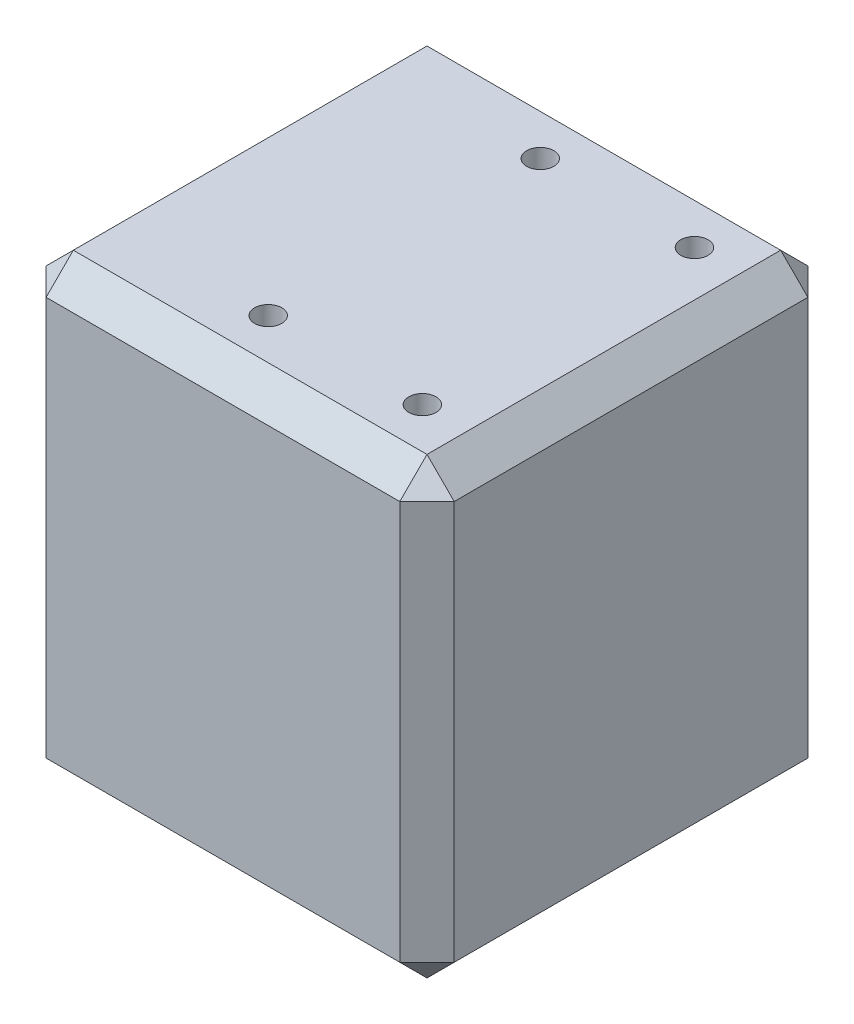
ISO-10303-21;
HEADER;
FILE_DESCRIPTION(('STEP AP214'),'2;1');
FILE_NAME('part.step','',(''),(''),'','','');
FILE_SCHEMA(('AUTOMOTIVE_DESIGN { 1 0 10303 214 1 1 1 1 }'));
ENDSEC;
DATA;
#1=APPLICATION_CONTEXT('core data for automotive mechanical design processes');
#2=APPLICATION_PROTOCOL_DEFINITION('international standard','automotive_design',2000,#1);
#3=PRODUCT_CONTEXT('',#1,'mechanical');
#4=PRODUCT('Part','Part','',(#3));
#5=PRODUCT_RELATED_PRODUCT_CATEGORY('part','',(#4));
#6=PRODUCT_DEFINITION_FORMATION('','',#4);
#7=PRODUCT_DEFINITION_CONTEXT('part definition',#1,'design');
#8=PRODUCT_DEFINITION('design','',#6,#7);
#9=PRODUCT_DEFINITION_SHAPE('','',#8);
#10=(LENGTH_UNIT() NAMED_UNIT(*) SI_UNIT(.MILLI.,.METRE.));
#11=(NAMED_UNIT(*) PLANE_ANGLE_UNIT() SI_UNIT($,.RADIAN.));
#12=(NAMED_UNIT(*) SI_UNIT($,.STERADIAN.) SOLID_ANGLE_UNIT());
#13=UNCERTAINTY_MEASURE_WITH_UNIT(LENGTH_MEASURE(1.E-05),#10,'distance_accuracy_value','');
#14=(GEOMETRIC_REPRESENTATION_CONTEXT(3) GLOBAL_UNCERTAINTY_ASSIGNED_CONTEXT((#13)) GLOBAL_UNIT_ASSIGNED_CONTEXT((#10,
#11,#12)) REPRESENTATION_CONTEXT('',''));
#15=CARTESIAN_POINT('',(0.,0.,0.));
#16=DIRECTION('',(0.,0.,1.));
#17=DIRECTION('',(1.,0.,0.));
#18=AXIS2_PLACEMENT_3D('',#15,#16,#17);
#19=CARTESIAN_POINT('',(22.5,50.,-22.5));
#20=DIRECTION('',(-1.,0.,0.));
#21=DIRECTION('',(0.,0.,1.));
#22=AXIS2_PLACEMENT_3D('',#19,#20,#21);
#23=PLANE('',#22);
#24=DIRECTION('',(0.,1.,0.));
#25=VECTOR('',#24,1.);
#26=CARTESIAN_POINT('',(22.5,50.,-19.5));
#27=LINE('',#26,#25);
#28=CARTESIAN_POINT('',(22.5,3.00000000000002,-19.5));
#29=VERTEX_POINT('',#28);
#30=CARTESIAN_POINT('',(22.5,47.,-19.5));
#31=VERTEX_POINT('',#30);
#32=EDGE_CURVE('E193',#29,#31,#27,.T.);
#33=ORIENTED_EDGE('',*,*,#32,.T.);
#34=DIRECTION('',(0.,0.,1.));
#35=VECTOR('',#34,1.);
#36=CARTESIAN_POINT('',(22.5,47.,22.5));
#37=LINE('',#36,#35);
#38=CARTESIAN_POINT('',(22.5,47.,19.5));
#39=VERTEX_POINT('',#38);
#40=EDGE_CURVE('E199',#31,#39,#37,.T.);
#41=ORIENTED_EDGE('',*,*,#40,.T.);
#42=DIRECTION('',(0.,-1.,0.));
#43=VECTOR('',#42,1.);
#44=CARTESIAN_POINT('',(22.5,50.,19.5));
#45=LINE('',#44,#43);
#46=CARTESIAN_POINT('',(22.5,3.00000000000002,19.5));
#47=VERTEX_POINT('',#46);
#48=EDGE_CURVE('E197',#39,#47,#45,.T.);
#49=ORIENTED_EDGE('',*,*,#48,.T.);
#50=DIRECTION('',(0.,0.,-1.));
#51=VECTOR('',#50,1.);
#52=CARTESIAN_POINT('',(22.5,3.00000000000002,-22.5));
#53=LINE('',#52,#51);
#54=EDGE_CURVE('E195',#47,#29,#53,.T.);
#55=ORIENTED_EDGE('',*,*,#54,.T.);
#56=EDGE_LOOP('',(#33,#41,#49,#55));
#57=FACE_BOUND('',#56,.T.);
#58=ADVANCED_FACE('F35',(#57),#23,.F.);
#59=CARTESIAN_POINT('',(-22.5,50.,-22.5));
#60=DIRECTION('',(0.,0.,1.));
#61=DIRECTION('',(1.,0.,0.));
#62=AXIS2_PLACEMENT_3D('',#59,#60,#61);
#63=PLANE('',#62);
#64=DIRECTION('',(0.,1.,0.));
#65=VECTOR('',#64,1.);
#66=CARTESIAN_POINT('',(-19.5,50.,-22.5));
#67=LINE('',#66,#65);
#68=CARTESIAN_POINT('',(-19.5,3.,-22.5));
#69=VERTEX_POINT('',#68);
#70=CARTESIAN_POINT('',(-19.5,47.,-22.5));
#71=VERTEX_POINT('',#70);
#72=EDGE_CURVE('E188',#69,#71,#67,.T.);
#73=ORIENTED_EDGE('',*,*,#72,.T.);
#74=DIRECTION('',(1.,0.,0.));
#75=VECTOR('',#74,1.);
#76=CARTESIAN_POINT('',(22.5,47.,-22.5));
#77=LINE('',#76,#75);
#78=CARTESIAN_POINT('',(19.5,47.,-22.5));
#79=VERTEX_POINT('',#78);
#80=EDGE_CURVE('E190',#71,#79,#77,.T.);
#81=ORIENTED_EDGE('',*,*,#80,.T.);
#82=DIRECTION('',(0.,-1.,0.));
#83=VECTOR('',#82,1.);
#84=CARTESIAN_POINT('',(19.5,50.,-22.5));
#85=LINE('',#84,#83);
#86=CARTESIAN_POINT('',(19.5,3.,-22.5));
#87=VERTEX_POINT('',#86);
#88=EDGE_CURVE('E184',#79,#87,#85,.T.);
#89=ORIENTED_EDGE('',*,*,#88,.T.);
#90=DIRECTION('',(-1.,0.,0.));
#91=VECTOR('',#90,1.);
#92=CARTESIAN_POINT('',(-22.5,3.,-22.5));
#93=LINE('',#92,#91);
#94=EDGE_CURVE('E186',#87,#69,#93,.T.);
#95=ORIENTED_EDGE('',*,*,#94,.T.);
#96=EDGE_LOOP('',(#73,#81,#89,#95));
#97=FACE_BOUND('',#96,.T.);
#98=CARTESIAN_POINT('',(0.,12.5,-22.5));
#99=DIRECTION('',(0.,0.,-1.));
#100=DIRECTION('',(-1.,0.,0.));
#101=AXIS2_PLACEMENT_3D('',#98,#99,#100);
#102=CIRCLE('',#101,4.15);
#103=CARTESIAN_POINT('',(-4.15,12.5,-22.5));
#104=VERTEX_POINT('',#103);
#105=EDGE_CURVE('E272',#104,#104,#102,.T.);
#106=ORIENTED_EDGE('',*,*,#105,.F.);
#107=EDGE_LOOP('',(#106));
#108=FACE_BOUND('',#107,.T.);
#109=ADVANCED_FACE('F329',(#97,#108),#63,.F.);
#110=CARTESIAN_POINT('',(-22.5,50.,-22.5));
#111=DIRECTION('',(1.,0.,0.));
#112=DIRECTION('',(0.,0.,-1.));
#113=AXIS2_PLACEMENT_3D('',#110,#111,#112);
#114=PLANE('',#113);
#115=DIRECTION('',(0.,1.,0.));
#116=VECTOR('',#115,1.);
#117=CARTESIAN_POINT('',(-22.5,50.,19.5));
#118=LINE('',#117,#116);
#119=CARTESIAN_POINT('',(-22.5,3.,19.5));
#120=VERTEX_POINT('',#119);
#121=CARTESIAN_POINT('',(-22.5,47.,19.5));
#122=VERTEX_POINT('',#121);
#123=EDGE_CURVE('E179',#120,#122,#118,.T.);
#124=ORIENTED_EDGE('',*,*,#123,.T.);
#125=DIRECTION('',(0.,0.,-1.));
#126=VECTOR('',#125,1.);
#127=CARTESIAN_POINT('',(-22.5,47.,-22.5));
#128=LINE('',#127,#126);
#129=CARTESIAN_POINT('',(-22.5,47.,-19.5));
#130=VERTEX_POINT('',#129);
#131=EDGE_CURVE('E181',#122,#130,#128,.T.);
#132=ORIENTED_EDGE('',*,*,#131,.T.);
#133=DIRECTION('',(0.,-1.,0.));
#134=VECTOR('',#133,1.);
#135=CARTESIAN_POINT('',(-22.5,50.,-19.5));
#136=LINE('',#135,#134);
#137=CARTESIAN_POINT('',(-22.5,3.,-19.5));
#138=VERTEX_POINT('',#137);
#139=EDGE_CURVE('E175',#130,#138,#136,.T.);
#140=ORIENTED_EDGE('',*,*,#139,.T.);
#141=DIRECTION('',(0.,0.,1.));
#142=VECTOR('',#141,1.);
#143=CARTESIAN_POINT('',(-22.5,3.,-22.5));
#144=LINE('',#143,#142);
#145=EDGE_CURVE('E177',#138,#120,#144,.T.);
#146=ORIENTED_EDGE('',*,*,#145,.T.);
#147=EDGE_LOOP('',(#124,#132,#140,#146));
#148=FACE_BOUND('',#147,.T.);
#149=CARTESIAN_POINT('',(-22.5,37.5,0.));
#150=DIRECTION('',(-1.,0.,0.));
#151=DIRECTION('',(0.,0.,1.));
#152=AXIS2_PLACEMENT_3D('',#149,#150,#151);
#153=CIRCLE('',#152,4.15);
#154=CARTESIAN_POINT('',(-22.5,37.5,4.15000000000001));
#155=VERTEX_POINT('',#154);
#156=EDGE_CURVE('E261',#155,#155,#153,.T.);
#157=ORIENTED_EDGE('',*,*,#156,.F.);
#158=EDGE_LOOP('',(#157));
#159=FACE_BOUND('',#158,.T.);
#160=ADVANCED_FACE('F335',(#148,#159),#114,.F.);
#161=CARTESIAN_POINT('',(-22.5,50.,22.5));
#162=DIRECTION('',(0.,0.,-1.));
#163=DIRECTION('',(-1.,0.,0.));
#164=AXIS2_PLACEMENT_3D('',#161,#162,#163);
#165=PLANE('',#164);
#166=DIRECTION('',(1.,0.,0.));
#167=VECTOR('',#166,1.);
#168=CARTESIAN_POINT('',(-22.5,3.,22.5));
#169=LINE('',#168,#167);
#170=CARTESIAN_POINT('',(-19.5,3.,22.5));
#171=VERTEX_POINT('',#170);
#172=CARTESIAN_POINT('',(19.5,3.,22.5));
#173=VERTEX_POINT('',#172);
#174=EDGE_CURVE('E166',#171,#173,#169,.T.);
#175=ORIENTED_EDGE('',*,*,#174,.T.);
#176=DIRECTION('',(0.,1.,0.));
#177=VECTOR('',#176,1.);
#178=CARTESIAN_POINT('',(19.5,50.,22.5));
#179=LINE('',#178,#177);
#180=CARTESIAN_POINT('',(19.5,47.,22.5));
#181=VERTEX_POINT('',#180);
#182=EDGE_CURVE('E173',#173,#181,#179,.T.);
#183=ORIENTED_EDGE('',*,*,#182,.T.);
#184=DIRECTION('',(-1.,0.,0.));
#185=VECTOR('',#184,1.);
#186=CARTESIAN_POINT('',(-22.5,47.,22.5));
#187=LINE('',#186,#185);
#188=CARTESIAN_POINT('',(-19.5,47.,22.5));
#189=VERTEX_POINT('',#188);
#190=EDGE_CURVE('E134',#181,#189,#187,.T.);
#191=ORIENTED_EDGE('',*,*,#190,.T.);
#192=DIRECTION('',(0.,-1.,0.));
#193=VECTOR('',#192,1.);
#194=CARTESIAN_POINT('',(-19.5,50.,22.5));
#195=LINE('',#194,#193);
#196=EDGE_CURVE('E164',#189,#171,#195,.T.);
#197=ORIENTED_EDGE('',*,*,#196,.T.);
#198=EDGE_LOOP('',(#175,#183,#191,#197));
#199=FACE_BOUND('',#198,.T.);
#200=ADVANCED_FACE('F302',(#199),#165,.F.);
#201=CARTESIAN_POINT('',(0.,50.,0.));
#202=DIRECTION('',(0.,1.,0.));
#203=DIRECTION('',(0.,0.,1.));
#204=AXIS2_PLACEMENT_3D('',#201,#202,#203);
#205=PLANE('',#204);
#206=CARTESIAN_POINT('',(-2.51000000000001,50.,-15.0000000000001));
#207=DIRECTION('',(0.,1.,0.));
#208=DIRECTION('',(0.,0.,-1.));
#209=AXIS2_PLACEMENT_3D('',#206,#207,#208);
#210=CIRCLE('',#209,1.5);
#211=CARTESIAN_POINT('',(-2.51000000000001,50.,-16.5000000000001));
#212=VERTEX_POINT('',#211);
#213=EDGE_CURVE('E661',#212,#212,#210,.T.);
#214=ORIENTED_EDGE('',*,*,#213,.F.);
#215=EDGE_LOOP('',(#214));
#216=FACE_BOUND('',#215,.T.);
#217=CARTESIAN_POINT('',(14.49,50.,-15.0000000000001));
#218=DIRECTION('',(0.,1.,0.));
#219=DIRECTION('',(0.,0.,-1.));
#220=AXIS2_PLACEMENT_3D('',#217,#218,#219);
#221=CIRCLE('',#220,1.5);
#222=CARTESIAN_POINT('',(14.49,50.,-16.5000000000001));
#223=VERTEX_POINT('',#222);
#224=EDGE_CURVE('E665',#223,#223,#221,.T.);
#225=ORIENTED_EDGE('',*,*,#224,.F.);
#226=EDGE_LOOP('',(#225));
#227=FACE_BOUND('',#226,.T.);
#228=CARTESIAN_POINT('',(14.49,50.,15.0000000000001));
#229=DIRECTION('',(0.,1.,0.));
#230=DIRECTION('',(0.,0.,1.));
#231=AXIS2_PLACEMENT_3D('',#228,#229,#230);
#232=CIRCLE('',#231,1.5);
#233=CARTESIAN_POINT('',(14.49,50.,16.5000000000001));
#234=VERTEX_POINT('',#233);
#235=EDGE_CURVE('E669',#234,#234,#232,.T.);
#236=ORIENTED_EDGE('',*,*,#235,.F.);
#237=EDGE_LOOP('',(#236));
#238=FACE_BOUND('',#237,.T.);
#239=CARTESIAN_POINT('',(-2.51,50.,15.0000000000001));
#240=DIRECTION('',(0.,1.,0.));
#241=DIRECTION('',(0.,0.,1.));
#242=AXIS2_PLACEMENT_3D('',#239,#240,#241);
#243=CIRCLE('',#242,1.5);
#244=CARTESIAN_POINT('',(-2.51,50.,16.5000000000001));
#245=VERTEX_POINT('',#244);
#246=EDGE_CURVE('E672',#245,#245,#243,.T.);
#247=ORIENTED_EDGE('',*,*,#246,.F.);
#248=EDGE_LOOP('',(#247));
#249=FACE_BOUND('',#248,.T.);
#250=DIRECTION('',(0.,0.,1.));
#251=VECTOR('',#250,1.);
#252=CARTESIAN_POINT('',(-19.5,50.,22.5));
#253=LINE('',#252,#251);
#254=CARTESIAN_POINT('',(-19.5,50.,-19.5));
#255=VERTEX_POINT('',#254);
#256=CARTESIAN_POINT('',(-19.5,50.,19.5));
#257=VERTEX_POINT('',#256);
#258=EDGE_CURVE('E162',#255,#257,#253,.T.);
#259=ORIENTED_EDGE('',*,*,#258,.T.);
#260=DIRECTION('',(1.,0.,0.));
#261=VECTOR('',#260,1.);
#262=CARTESIAN_POINT('',(22.5,50.,19.5));
#263=LINE('',#262,#261);
#264=CARTESIAN_POINT('',(19.5,50.,19.5));
#265=VERTEX_POINT('',#264);
#266=EDGE_CURVE('E132',#257,#265,#263,.T.);
#267=ORIENTED_EDGE('',*,*,#266,.T.);
#268=DIRECTION('',(0.,0.,-1.));
#269=VECTOR('',#268,1.);
#270=CARTESIAN_POINT('',(19.5,50.,-22.5));
#271=LINE('',#270,#269);
#272=CARTESIAN_POINT('',(19.5,50.,-19.5));
#273=VERTEX_POINT('',#272);
#274=EDGE_CURVE('E151',#265,#273,#271,.T.);
#275=ORIENTED_EDGE('',*,*,#274,.T.);
#276=DIRECTION('',(-1.,0.,0.));
#277=VECTOR('',#276,1.);
#278=CARTESIAN_POINT('',(-22.5,50.,-19.5));
#279=LINE('',#278,#277);
#280=EDGE_CURVE('E157',#273,#255,#279,.T.);
#281=ORIENTED_EDGE('',*,*,#280,.T.);
#282=EDGE_LOOP('',(#259,#267,#275,#281));
#283=FACE_BOUND('',#282,.T.);
#284=ADVANCED_FACE('F160',(#216,#227,#238,#249,#283),#205,.T.);
#285=CARTESIAN_POINT('',(0.,0.,0.));
#286=DIRECTION('',(0.,1.,0.));
#287=DIRECTION('',(0.,0.,1.));
#288=AXIS2_PLACEMENT_3D('',#285,#286,#287);
#289=PLANE('',#288);
#290=DIRECTION('',(0.,0.,1.));
#291=VECTOR('',#290,1.);
#292=CARTESIAN_POINT('',(19.5,0.,0.));
#293=LINE('',#292,#291);
#294=CARTESIAN_POINT('',(19.5,0.,-19.5));
#295=VERTEX_POINT('',#294);
#296=CARTESIAN_POINT('',(19.5,0.,19.5));
#297=VERTEX_POINT('',#296);
#298=EDGE_CURVE('E44',#295,#297,#293,.T.);
#299=ORIENTED_EDGE('',*,*,#298,.T.);
#300=DIRECTION('',(-1.,0.,0.));
#301=VECTOR('',#300,1.);
#302=CARTESIAN_POINT('',(0.,0.,19.5));
#303=LINE('',#302,#301);
#304=CARTESIAN_POINT('',(-19.5,0.,19.5));
#305=VERTEX_POINT('',#304);
#306=EDGE_CURVE('E11',#297,#305,#303,.T.);
#307=ORIENTED_EDGE('',*,*,#306,.T.);
#308=DIRECTION('',(0.,0.,-1.));
#309=VECTOR('',#308,1.);
#310=CARTESIAN_POINT('',(-19.5,0.,0.));
#311=LINE('',#310,#309);
#312=CARTESIAN_POINT('',(-19.5,0.,-19.5));
#313=VERTEX_POINT('',#312);
#314=EDGE_CURVE('E204',#305,#313,#311,.T.);
#315=ORIENTED_EDGE('',*,*,#314,.T.);
#316=DIRECTION('',(1.,0.,0.));
#317=VECTOR('',#316,1.);
#318=CARTESIAN_POINT('',(0.,0.,-19.5));
#319=LINE('',#318,#317);
#320=EDGE_CURVE('E202',#313,#295,#319,.T.);
#321=ORIENTED_EDGE('',*,*,#320,.T.);
#322=EDGE_LOOP('',(#299,#307,#315,#321));
#323=FACE_BOUND('',#322,.T.);
#324=ADVANCED_FACE('F604',(#323),#289,.F.);
#325=CARTESIAN_POINT('',(0.,12.5,7.5));
#326=DIRECTION('',(0.,0.,-1.));
#327=DIRECTION('',(-1.,0.,0.));
#328=AXIS2_PLACEMENT_3D('',#325,#326,#327);
#329=CYLINDRICAL_SURFACE('',#328,4.15);
#330=CARTESIAN_POINT('',(0.,12.5,7.5));
#331=DIRECTION('',(0.,0.,-1.));
#332=DIRECTION('',(-1.,0.,0.));
#333=AXIS2_PLACEMENT_3D('',#330,#331,#332);
#334=CIRCLE('',#333,4.15);
#335=CARTESIAN_POINT('',(-4.15,12.5,7.5));
#336=VERTEX_POINT('',#335);
#337=EDGE_CURVE('E158',#336,#336,#334,.T.);
#338=ORIENTED_EDGE('',*,*,#337,.F.);
#339=EDGE_LOOP('',(#338));
#340=FACE_BOUND('',#339,.T.);
#341=ORIENTED_EDGE('',*,*,#105,.T.);
#342=EDGE_LOOP('',(#341));
#343=FACE_BOUND('',#342,.T.);
#344=ADVANCED_FACE('F595',(#340,#343),#329,.F.);
#345=CARTESIAN_POINT('',(0.,12.5,7.5));
#346=DIRECTION('',(0.,0.,-1.));
#347=DIRECTION('',(-1.,0.,0.));
#348=AXIS2_PLACEMENT_3D('',#345,#346,#347);
#349=PLANE('',#348);
#350=ORIENTED_EDGE('',*,*,#337,.T.);
#351=EDGE_LOOP('',(#350));
#352=FACE_BOUND('',#351,.T.);
#353=ADVANCED_FACE('F586',(#352),#349,.T.);
#354=CARTESIAN_POINT('',(7.50000000000001,37.5,0.));
#355=DIRECTION('',(-1.,0.,0.));
#356=DIRECTION('',(0.,0.,1.));
#357=AXIS2_PLACEMENT_3D('',#354,#355,#356);
#358=CYLINDRICAL_SURFACE('',#357,4.15);
#359=CARTESIAN_POINT('',(7.50000000000001,37.5,0.));
#360=DIRECTION('',(-1.,0.,0.));
#361=DIRECTION('',(0.,0.,1.));
#362=AXIS2_PLACEMENT_3D('',#359,#360,#361);
#363=CIRCLE('',#362,4.15);
#364=CARTESIAN_POINT('',(7.50000000000001,37.5,4.15));
#365=VERTEX_POINT('',#364);
#366=EDGE_CURVE('E267',#365,#365,#363,.T.);
#367=ORIENTED_EDGE('',*,*,#366,.F.);
#368=EDGE_LOOP('',(#367));
#369=FACE_BOUND('',#368,.T.);
#370=ORIENTED_EDGE('',*,*,#156,.T.);
#371=EDGE_LOOP('',(#370));
#372=FACE_BOUND('',#371,.T.);
#373=ADVANCED_FACE('F577',(#369,#372),#358,.F.);
#374=CARTESIAN_POINT('',(7.50000000000001,37.5,0.));
#375=DIRECTION('',(-1.,0.,0.));
#376=DIRECTION('',(0.,0.,1.));
#377=AXIS2_PLACEMENT_3D('',#374,#375,#376);
#378=PLANE('',#377);
#379=ORIENTED_EDGE('',*,*,#366,.T.);
#380=EDGE_LOOP('',(#379));
#381=FACE_BOUND('',#380,.T.);
#382=ADVANCED_FACE('F569',(#381),#378,.T.);
#383=CARTESIAN_POINT('',(-22.5,3.,-22.5));
#384=DIRECTION('',(0.,0.707106781186549,0.707106781186546));
#385=DIRECTION('',(-1.,0.,0.));
#386=AXIS2_PLACEMENT_3D('',#383,#384,#385);
#387=PLANE('',#386);
#388=DIRECTION('',(0.,0.707106781186546,-0.707106781186549));
#389=VECTOR('',#388,1.);
#390=CARTESIAN_POINT('',(-19.5,0.,-19.5));
#391=LINE('',#390,#389);
#392=EDGE_CURVE('E39',#69,#313,#391,.F.);
#393=ORIENTED_EDGE('',*,*,#392,.F.);
#394=ORIENTED_EDGE('',*,*,#94,.F.);
#395=DIRECTION('',(0.,-0.707106781186546,0.707106781186549));
#396=VECTOR('',#395,1.);
#397=CARTESIAN_POINT('',(19.5,1.5,-21.));
#398=LINE('',#397,#396);
#399=EDGE_CURVE('E254',#295,#87,#398,.F.);
#400=ORIENTED_EDGE('',*,*,#399,.F.);
#401=ORIENTED_EDGE('',*,*,#320,.F.);
#402=EDGE_LOOP('',(#393,#394,#400,#401));
#403=FACE_BOUND('',#402,.T.);
#404=ADVANCED_FACE('F37',(#403),#387,.F.);
#405=CARTESIAN_POINT('',(-19.5,0.,-19.5));
#406=DIRECTION('',(-0.577350269189626,-0.577350269189628,-0.577350269189623));
#407=DIRECTION('',(0.707106781186549,-0.707106781186546,0.));
#408=AXIS2_PLACEMENT_3D('',#405,#406,#407);
#409=PLANE('',#408);
#410=DIRECTION('',(-0.707106781186546,0.,0.707106781186549));
#411=VECTOR('',#410,1.);
#412=CARTESIAN_POINT('',(-21.,3.,-21.));
#413=LINE('',#412,#411);
#414=EDGE_CURVE('E249',#69,#138,#413,.T.);
#415=ORIENTED_EDGE('',*,*,#414,.F.);
#416=ORIENTED_EDGE('',*,*,#392,.T.);
#417=DIRECTION('',(0.707106781186549,-0.707106781186546,0.));
#418=VECTOR('',#417,1.);
#419=CARTESIAN_POINT('',(-19.5,0.,-19.5));
#420=LINE('',#419,#418);
#421=EDGE_CURVE('E252',#138,#313,#420,.T.);
#422=ORIENTED_EDGE('',*,*,#421,.F.);
#423=EDGE_LOOP('',(#415,#416,#422));
#424=FACE_BOUND('',#423,.T.);
#425=ADVANCED_FACE('F555',(#424),#409,.T.);
#426=CARTESIAN_POINT('',(22.5,3.00000000000002,-19.5));
#427=DIRECTION('',(0.577350269189628,-0.577350269189625,-0.577350269189624));
#428=DIRECTION('',(0.707106781186546,0.707106781186549,0.));
#429=AXIS2_PLACEMENT_3D('',#426,#427,#428);
#430=PLANE('',#429);
#431=DIRECTION('',(0.707106781186546,0.707106781186549,0.));
#432=VECTOR('',#431,1.);
#433=CARTESIAN_POINT('',(22.5,3.00000000000002,-19.5));
#434=LINE('',#433,#432);
#435=EDGE_CURVE('E243',#295,#29,#434,.T.);
#436=ORIENTED_EDGE('',*,*,#435,.F.);
#437=ORIENTED_EDGE('',*,*,#399,.T.);
#438=DIRECTION('',(-0.707106781186547,0.,-0.707106781186548));
#439=VECTOR('',#438,1.);
#440=CARTESIAN_POINT('',(22.5,3.00000000000002,-19.5));
#441=LINE('',#440,#439);
#442=EDGE_CURVE('E246',#29,#87,#441,.T.);
#443=ORIENTED_EDGE('',*,*,#442,.F.);
#444=EDGE_LOOP('',(#436,#437,#443));
#445=FACE_BOUND('',#444,.T.);
#446=ADVANCED_FACE('F546',(#445),#430,.T.);
#447=CARTESIAN_POINT('',(-22.5,3.,-22.5));
#448=DIRECTION('',(0.707106781186546,0.707106781186549,0.));
#449=DIRECTION('',(0.,0.,1.));
#450=AXIS2_PLACEMENT_3D('',#447,#448,#449);
#451=PLANE('',#450);
#452=ORIENTED_EDGE('',*,*,#421,.T.);
#453=ORIENTED_EDGE('',*,*,#314,.F.);
#454=DIRECTION('',(-0.707106781186549,0.707106781186546,0.));
#455=VECTOR('',#454,1.);
#456=CARTESIAN_POINT('',(-19.5,0.,19.5));
#457=LINE('',#456,#455);
#458=EDGE_CURVE('E58',#120,#305,#457,.F.);
#459=ORIENTED_EDGE('',*,*,#458,.F.);
#460=ORIENTED_EDGE('',*,*,#145,.F.);
#461=EDGE_LOOP('',(#452,#453,#459,#460));
#462=FACE_BOUND('',#461,.T.);
#463=ADVANCED_FACE('F537',(#462),#451,.F.);
#464=CARTESIAN_POINT('',(-22.5,50.,-19.5));
#465=DIRECTION('',(0.707106781186549,0.,0.707106781186546));
#466=DIRECTION('',(0.,-1.,0.));
#467=AXIS2_PLACEMENT_3D('',#464,#465,#466);
#468=PLANE('',#467);
#469=ORIENTED_EDGE('',*,*,#414,.T.);
#470=ORIENTED_EDGE('',*,*,#139,.F.);
#471=DIRECTION('',(0.707106781186546,0.,-0.707106781186549));
#472=VECTOR('',#471,1.);
#473=CARTESIAN_POINT('',(-22.5,47.,-19.5));
#474=LINE('',#473,#472);
#475=EDGE_CURVE('E237',#71,#130,#474,.F.);
#476=ORIENTED_EDGE('',*,*,#475,.F.);
#477=ORIENTED_EDGE('',*,*,#72,.F.);
#478=EDGE_LOOP('',(#469,#470,#476,#477));
#479=FACE_BOUND('',#478,.T.);
#480=ADVANCED_FACE('F529',(#479),#468,.F.);
#481=CARTESIAN_POINT('',(0.,50.,-19.5));
#482=DIRECTION('',(0.,0.707106781186549,-0.707106781186546));
#483=DIRECTION('',(1.,0.,0.));
#484=AXIS2_PLACEMENT_3D('',#481,#482,#483);
#485=PLANE('',#484);
#486=DIRECTION('',(0.,0.707106781186546,0.707106781186549));
#487=VECTOR('',#486,1.);
#488=CARTESIAN_POINT('',(19.5,47.,-22.5));
#489=LINE('',#488,#487);
#490=EDGE_CURVE('E231',#79,#273,#489,.T.);
#491=ORIENTED_EDGE('',*,*,#490,.F.);
#492=ORIENTED_EDGE('',*,*,#80,.F.);
#493=DIRECTION('',(0.,-0.707106781186546,-0.707106781186549));
#494=VECTOR('',#493,1.);
#495=CARTESIAN_POINT('',(-19.5,48.5,-21.));
#496=LINE('',#495,#494);
#497=EDGE_CURVE('E234',#255,#71,#496,.T.);
#498=ORIENTED_EDGE('',*,*,#497,.F.);
#499=ORIENTED_EDGE('',*,*,#280,.F.);
#500=EDGE_LOOP('',(#491,#492,#498,#499));
#501=FACE_BOUND('',#500,.T.);
#502=ADVANCED_FACE('F284',(#501),#485,.T.);
#503=CARTESIAN_POINT('',(19.5,50.,-22.5));
#504=DIRECTION('',(-0.707106781186548,0.,0.707106781186547));
#505=DIRECTION('',(0.,-1.,0.));
#506=AXIS2_PLACEMENT_3D('',#503,#504,#505);
#507=PLANE('',#506);
#508=ORIENTED_EDGE('',*,*,#442,.T.);
#509=ORIENTED_EDGE('',*,*,#88,.F.);
#510=DIRECTION('',(0.707106781186547,0.,0.707106781186548));
#511=VECTOR('',#510,1.);
#512=CARTESIAN_POINT('',(19.5,47.,-22.5));
#513=LINE('',#512,#511);
#514=EDGE_CURVE('E229',#31,#79,#513,.F.);
#515=ORIENTED_EDGE('',*,*,#514,.F.);
#516=ORIENTED_EDGE('',*,*,#32,.F.);
#517=EDGE_LOOP('',(#508,#509,#515,#516));
#518=FACE_BOUND('',#517,.T.);
#519=ADVANCED_FACE('F314',(#518),#507,.F.);
#520=CARTESIAN_POINT('',(22.5,3.00000000000002,-22.5));
#521=DIRECTION('',(-0.707106781186549,0.707106781186546,0.));
#522=DIRECTION('',(0.,0.,-1.));
#523=AXIS2_PLACEMENT_3D('',#520,#521,#522);
#524=PLANE('',#523);
#525=ORIENTED_EDGE('',*,*,#435,.T.);
#526=ORIENTED_EDGE('',*,*,#54,.F.);
#527=DIRECTION('',(-0.707106781186546,-0.707106781186549,0.));
#528=VECTOR('',#527,1.);
#529=CARTESIAN_POINT('',(21.,1.5,19.5));
#530=LINE('',#529,#528);
#531=EDGE_CURVE('E226',#297,#47,#530,.F.);
#532=ORIENTED_EDGE('',*,*,#531,.F.);
#533=ORIENTED_EDGE('',*,*,#298,.F.);
#534=EDGE_LOOP('',(#525,#526,#532,#533));
#535=FACE_BOUND('',#534,.T.);
#536=ADVANCED_FACE('F505',(#535),#524,.F.);
#537=CARTESIAN_POINT('',(-22.5,3.,22.5));
#538=DIRECTION('',(0.,0.707106781186549,-0.707106781186546));
#539=DIRECTION('',(1.,0.,0.));
#540=AXIS2_PLACEMENT_3D('',#537,#538,#539);
#541=PLANE('',#540);
#542=DIRECTION('',(0.,-0.707106781186546,-0.707106781186549));
#543=VECTOR('',#542,1.);
#544=CARTESIAN_POINT('',(-19.5,0.,19.5));
#545=LINE('',#544,#543);
#546=EDGE_CURVE('E241',#305,#171,#545,.F.);
#547=ORIENTED_EDGE('',*,*,#546,.F.);
#548=ORIENTED_EDGE('',*,*,#306,.F.);
#549=DIRECTION('',(0.,0.707106781186546,0.707106781186549));
#550=VECTOR('',#549,1.);
#551=CARTESIAN_POINT('',(19.5,3.,22.5));
#552=LINE('',#551,#550);
#553=EDGE_CURVE('E223',#173,#297,#552,.F.);
#554=ORIENTED_EDGE('',*,*,#553,.F.);
#555=ORIENTED_EDGE('',*,*,#174,.F.);
#556=EDGE_LOOP('',(#547,#548,#554,#555));
#557=FACE_BOUND('',#556,.T.);
#558=ADVANCED_FACE('F497',(#557),#541,.F.);
#559=CARTESIAN_POINT('',(-19.5,0.,19.5));
#560=DIRECTION('',(-0.577350269189627,-0.577350269189628,0.577350269189623));
#561=DIRECTION('',(0.707106781186548,-0.707106781186547,0.));
#562=AXIS2_PLACEMENT_3D('',#559,#560,#561);
#563=PLANE('',#562);
#564=ORIENTED_EDGE('',*,*,#458,.T.);
#565=ORIENTED_EDGE('',*,*,#546,.T.);
#566=DIRECTION('',(0.707106781186545,0.,0.70710678118655));
#567=VECTOR('',#566,1.);
#568=CARTESIAN_POINT('',(-21.,3.,21.));
#569=LINE('',#568,#567);
#570=EDGE_CURVE('E220',#120,#171,#569,.T.);
#571=ORIENTED_EDGE('',*,*,#570,.F.);
#572=EDGE_LOOP('',(#564,#565,#571));
#573=FACE_BOUND('',#572,.T.);
#574=ADVANCED_FACE('F326',(#573),#563,.T.);
#575=CARTESIAN_POINT('',(-22.5,47.,-19.5));
#576=DIRECTION('',(-0.577350269189628,0.577350269189626,-0.577350269189623));
#577=DIRECTION('',(-0.707106781186546,-0.707106781186549,0.));
#578=AXIS2_PLACEMENT_3D('',#575,#576,#577);
#579=PLANE('',#578);
#580=ORIENTED_EDGE('',*,*,#497,.T.);
#581=ORIENTED_EDGE('',*,*,#475,.T.);
#582=DIRECTION('',(0.707106781186546,0.707106781186549,0.));
#583=VECTOR('',#582,1.);
#584=CARTESIAN_POINT('',(-22.5,47.,-19.5));
#585=LINE('',#584,#583);
#586=EDGE_CURVE('E218',#255,#130,#585,.F.);
#587=ORIENTED_EDGE('',*,*,#586,.F.);
#588=EDGE_LOOP('',(#580,#581,#587));
#589=FACE_BOUND('',#588,.T.);
#590=ADVANCED_FACE('F287',(#589),#579,.T.);
#591=CARTESIAN_POINT('',(19.5,47.,-22.5));
#592=DIRECTION('',(0.577350269189628,0.577350269189625,-0.577350269189624));
#593=DIRECTION('',(-0.707106781186546,0.707106781186549,0.));
#594=AXIS2_PLACEMENT_3D('',#591,#592,#593);
#595=PLANE('',#594);
#596=ORIENTED_EDGE('',*,*,#514,.T.);
#597=ORIENTED_EDGE('',*,*,#490,.T.);
#598=DIRECTION('',(0.707106781186546,-0.707106781186549,0.));
#599=VECTOR('',#598,1.);
#600=CARTESIAN_POINT('',(21.,48.5,-19.5));
#601=LINE('',#600,#599);
#602=EDGE_CURVE('E154',#31,#273,#601,.F.);
#603=ORIENTED_EDGE('',*,*,#602,.F.);
#604=EDGE_LOOP('',(#596,#597,#603));
#605=FACE_BOUND('',#604,.T.);
#606=ADVANCED_FACE('F316',(#605),#595,.T.);
#607=CARTESIAN_POINT('',(19.5,3.,22.5));
#608=DIRECTION('',(0.577350269189629,-0.577350269189625,0.577350269189624));
#609=DIRECTION('',(0.707106781186545,0.70710678118655,0.));
#610=AXIS2_PLACEMENT_3D('',#607,#608,#609);
#611=PLANE('',#610);
#612=ORIENTED_EDGE('',*,*,#553,.T.);
#613=ORIENTED_EDGE('',*,*,#531,.T.);
#614=DIRECTION('',(0.707106781186546,0.,-0.707106781186549));
#615=VECTOR('',#614,1.);
#616=CARTESIAN_POINT('',(19.5,3.,22.5));
#617=LINE('',#616,#615);
#618=EDGE_CURVE('E214',#173,#47,#617,.T.);
#619=ORIENTED_EDGE('',*,*,#618,.F.);
#620=EDGE_LOOP('',(#612,#613,#619));
#621=FACE_BOUND('',#620,.T.);
#622=ADVANCED_FACE('F318',(#621),#611,.T.);
#623=CARTESIAN_POINT('',(-19.5,50.,22.5));
#624=DIRECTION('',(0.70710678118655,0.,-0.707106781186545));
#625=DIRECTION('',(0.,-1.,0.));
#626=AXIS2_PLACEMENT_3D('',#623,#624,#625);
#627=PLANE('',#626);
#628=ORIENTED_EDGE('',*,*,#570,.T.);
#629=ORIENTED_EDGE('',*,*,#196,.F.);
#630=DIRECTION('',(-0.707106781186545,0.,-0.70710678118655));
#631=VECTOR('',#630,1.);
#632=CARTESIAN_POINT('',(-19.5,47.,22.5));
#633=LINE('',#632,#631);
#634=EDGE_CURVE('E211',#122,#189,#633,.F.);
#635=ORIENTED_EDGE('',*,*,#634,.F.);
#636=ORIENTED_EDGE('',*,*,#123,.F.);
#637=EDGE_LOOP('',(#628,#629,#635,#636));
#638=FACE_BOUND('',#637,.T.);
#639=ADVANCED_FACE('F299',(#638),#627,.F.);
#640=CARTESIAN_POINT('',(-19.5,50.,0.));
#641=DIRECTION('',(-0.707106781186549,0.707106781186546,0.));
#642=DIRECTION('',(0.,0.,-1.));
#643=AXIS2_PLACEMENT_3D('',#640,#641,#642);
#644=PLANE('',#643);
#645=ORIENTED_EDGE('',*,*,#586,.T.);
#646=ORIENTED_EDGE('',*,*,#131,.F.);
#647=DIRECTION('',(-0.707106781186546,-0.707106781186549,0.));
#648=VECTOR('',#647,1.);
#649=CARTESIAN_POINT('',(-21.,48.5,19.5));
#650=LINE('',#649,#648);
#651=EDGE_CURVE('E148',#257,#122,#650,.T.);
#652=ORIENTED_EDGE('',*,*,#651,.F.);
#653=ORIENTED_EDGE('',*,*,#258,.F.);
#654=EDGE_LOOP('',(#645,#646,#652,#653));
#655=FACE_BOUND('',#654,.T.);
#656=ADVANCED_FACE('F291',(#655),#644,.T.);
#657=CARTESIAN_POINT('',(19.5,50.,0.));
#658=DIRECTION('',(0.707106781186549,0.707106781186546,0.));
#659=DIRECTION('',(0.,0.,1.));
#660=AXIS2_PLACEMENT_3D('',#657,#658,#659);
#661=PLANE('',#660);
#662=ORIENTED_EDGE('',*,*,#602,.T.);
#663=ORIENTED_EDGE('',*,*,#274,.F.);
#664=DIRECTION('',(-0.707106781186546,0.707106781186549,0.));
#665=VECTOR('',#664,1.);
#666=CARTESIAN_POINT('',(19.5,50.,19.5));
#667=LINE('',#666,#665);
#668=EDGE_CURVE('E140',#39,#265,#667,.T.);
#669=ORIENTED_EDGE('',*,*,#668,.F.);
#670=ORIENTED_EDGE('',*,*,#40,.F.);
#671=EDGE_LOOP('',(#662,#663,#669,#670));
#672=FACE_BOUND('',#671,.T.);
#673=ADVANCED_FACE('F152',(#672),#661,.T.);
#674=CARTESIAN_POINT('',(22.5,50.,19.5));
#675=DIRECTION('',(-0.707106781186549,0.,-0.707106781186546));
#676=DIRECTION('',(0.,-1.,0.));
#677=AXIS2_PLACEMENT_3D('',#674,#675,#676);
#678=PLANE('',#677);
#679=ORIENTED_EDGE('',*,*,#618,.T.);
#680=ORIENTED_EDGE('',*,*,#48,.F.);
#681=DIRECTION('',(-0.707106781186546,0.,0.707106781186549));
#682=VECTOR('',#681,1.);
#683=CARTESIAN_POINT('',(21.,47.,21.));
#684=LINE('',#683,#682);
#685=EDGE_CURVE('E144',#181,#39,#684,.F.);
#686=ORIENTED_EDGE('',*,*,#685,.F.);
#687=ORIENTED_EDGE('',*,*,#182,.F.);
#688=EDGE_LOOP('',(#679,#680,#686,#687));
#689=FACE_BOUND('',#688,.T.);
#690=ADVANCED_FACE('F306',(#689),#678,.F.);
#691=CARTESIAN_POINT('',(-19.5,47.,22.5));
#692=DIRECTION('',(-0.577350269189629,0.577350269189623,0.577350269189625));
#693=DIRECTION('',(0.707106781186545,0.,0.70710678118655));
#694=AXIS2_PLACEMENT_3D('',#691,#692,#693);
#695=PLANE('',#694);
#696=ORIENTED_EDGE('',*,*,#651,.T.);
#697=ORIENTED_EDGE('',*,*,#634,.T.);
#698=DIRECTION('',(0.,0.707106781186549,-0.707106781186546));
#699=VECTOR('',#698,1.);
#700=CARTESIAN_POINT('',(-19.5,47.,22.5));
#701=LINE('',#700,#699);
#702=EDGE_CURVE('E136',#257,#189,#701,.F.);
#703=ORIENTED_EDGE('',*,*,#702,.F.);
#704=EDGE_LOOP('',(#696,#697,#703));
#705=FACE_BOUND('',#704,.T.);
#706=ADVANCED_FACE('F295',(#705),#695,.T.);
#707=CARTESIAN_POINT('',(19.5,50.,19.5));
#708=DIRECTION('',(0.577350269189629,0.577350269189622,0.577350269189626));
#709=DIRECTION('',(0.707106781186546,0.,-0.707106781186549));
#710=AXIS2_PLACEMENT_3D('',#707,#708,#709);
#711=PLANE('',#710);
#712=ORIENTED_EDGE('',*,*,#685,.T.);
#713=ORIENTED_EDGE('',*,*,#668,.T.);
#714=DIRECTION('',(0.,-0.707106781186549,0.707106781186546));
#715=VECTOR('',#714,1.);
#716=CARTESIAN_POINT('',(19.5,50.,19.5));
#717=LINE('',#716,#715);
#718=EDGE_CURVE('E128',#181,#265,#717,.F.);
#719=ORIENTED_EDGE('',*,*,#718,.F.);
#720=EDGE_LOOP('',(#712,#713,#719));
#721=FACE_BOUND('',#720,.T.);
#722=ADVANCED_FACE('F142',(#721),#711,.T.);
#723=CARTESIAN_POINT('',(0.,50.,19.5));
#724=DIRECTION('',(0.,0.707106781186546,0.707106781186549));
#725=DIRECTION('',(-1.,0.,0.));
#726=AXIS2_PLACEMENT_3D('',#723,#724,#725);
#727=PLANE('',#726);
#728=ORIENTED_EDGE('',*,*,#702,.T.);
#729=ORIENTED_EDGE('',*,*,#190,.F.);
#730=ORIENTED_EDGE('',*,*,#718,.T.);
#731=ORIENTED_EDGE('',*,*,#266,.F.);
#732=EDGE_LOOP('',(#728,#729,#730,#731));
#733=FACE_BOUND('',#732,.T.);
#734=ADVANCED_FACE('F130',(#733),#727,.T.);
#735=CARTESIAN_POINT('',(-2.51,40.,15.0000000000001));
#736=DIRECTION('',(0.,1.,0.));
#737=DIRECTION('',(0.,0.,1.));
#738=AXIS2_PLACEMENT_3D('',#735,#736,#737);
#739=CYLINDRICAL_SURFACE('',#738,1.5);
#740=CARTESIAN_POINT('',(-2.51,40.,15.0000000000001));
#741=DIRECTION('',(0.,1.,0.));
#742=DIRECTION('',(0.,0.,1.));
#743=AXIS2_PLACEMENT_3D('',#740,#741,#742);
#744=CIRCLE('',#743,1.5);
#745=CARTESIAN_POINT('',(-2.51,40.,16.5000000000001));
#746=VERTEX_POINT('',#745);
#747=EDGE_CURVE('E137',#746,#746,#744,.T.);
#748=ORIENTED_EDGE('',*,*,#747,.F.);
#749=EDGE_LOOP('',(#748));
#750=FACE_BOUND('',#749,.T.);
#751=ORIENTED_EDGE('',*,*,#246,.T.);
#752=EDGE_LOOP('',(#751));
#753=FACE_BOUND('',#752,.T.);
#754=ADVANCED_FACE('F342',(#750,#753),#739,.F.);
#755=CARTESIAN_POINT('',(-2.51,40.,15.0000000000001));
#756=DIRECTION('',(0.,1.,0.));
#757=DIRECTION('',(0.,0.,1.));
#758=AXIS2_PLACEMENT_3D('',#755,#756,#757);
#759=PLANE('',#758);
#760=ORIENTED_EDGE('',*,*,#747,.T.);
#761=EDGE_LOOP('',(#760));
#762=FACE_BOUND('',#761,.T.);
#763=ADVANCED_FACE('F389',(#762),#759,.T.);
#764=CARTESIAN_POINT('',(14.49,40.,15.0000000000001));
#765=DIRECTION('',(0.,1.,0.));
#766=DIRECTION('',(0.,0.,1.));
#767=AXIS2_PLACEMENT_3D('',#764,#765,#766);
#768=CYLINDRICAL_SURFACE('',#767,1.5);
#769=CARTESIAN_POINT('',(14.49,40.,15.0000000000001));
#770=DIRECTION('',(0.,1.,0.));
#771=DIRECTION('',(0.,0.,1.));
#772=AXIS2_PLACEMENT_3D('',#769,#770,#771);
#773=CIRCLE('',#772,1.5);
#774=CARTESIAN_POINT('',(14.49,40.,16.5000000000001));
#775=VERTEX_POINT('',#774);
#776=EDGE_CURVE('E674',#775,#775,#773,.T.);
#777=ORIENTED_EDGE('',*,*,#776,.F.);
#778=EDGE_LOOP('',(#777));
#779=FACE_BOUND('',#778,.T.);
#780=ORIENTED_EDGE('',*,*,#235,.T.);
#781=EDGE_LOOP('',(#780));
#782=FACE_BOUND('',#781,.T.);
#783=ADVANCED_FACE('F397',(#779,#782),#768,.F.);
#784=CARTESIAN_POINT('',(14.49,40.,15.0000000000001));
#785=DIRECTION('',(0.,1.,0.));
#786=DIRECTION('',(0.,0.,1.));
#787=AXIS2_PLACEMENT_3D('',#784,#785,#786);
#788=PLANE('',#787);
#789=ORIENTED_EDGE('',*,*,#776,.T.);
#790=EDGE_LOOP('',(#789));
#791=FACE_BOUND('',#790,.T.);
#792=ADVANCED_FACE('F405',(#791),#788,.T.);
#793=CARTESIAN_POINT('',(14.49,40.,-15.0000000000001));
#794=DIRECTION('',(0.,1.,0.));
#795=DIRECTION('',(0.,0.,1.));
#796=AXIS2_PLACEMENT_3D('',#793,#794,#795);
#797=CYLINDRICAL_SURFACE('',#796,1.5);
#798=CARTESIAN_POINT('',(14.49,40.,-15.0000000000001));
#799=DIRECTION('',(0.,1.,0.));
#800=DIRECTION('',(0.,0.,-1.));
#801=AXIS2_PLACEMENT_3D('',#798,#799,#800);
#802=CIRCLE('',#801,1.5);
#803=CARTESIAN_POINT('',(14.49,40.,-16.5000000000001));
#804=VERTEX_POINT('',#803);
#805=EDGE_CURVE('E685',#804,#804,#802,.T.);
#806=ORIENTED_EDGE('',*,*,#805,.F.);
#807=EDGE_LOOP('',(#806));
#808=FACE_BOUND('',#807,.T.);
#809=ORIENTED_EDGE('',*,*,#224,.T.);
#810=EDGE_LOOP('',(#809));
#811=FACE_BOUND('',#810,.T.);
#812=ADVANCED_FACE('F413',(#808,#811),#797,.F.);
#813=CARTESIAN_POINT('',(14.49,40.,-15.0000000000001));
#814=DIRECTION('',(0.,-1.,0.));
#815=DIRECTION('',(0.,0.,-1.));
#816=AXIS2_PLACEMENT_3D('',#813,#814,#815);
#817=PLANE('',#816);
#818=ORIENTED_EDGE('',*,*,#805,.T.);
#819=EDGE_LOOP('',(#818));
#820=FACE_BOUND('',#819,.T.);
#821=ADVANCED_FACE('F421',(#820),#817,.F.);
#822=CARTESIAN_POINT('',(-2.51000000000001,40.,-15.0000000000001));
#823=DIRECTION('',(0.,1.,0.));
#824=DIRECTION('',(0.,0.,1.));
#825=AXIS2_PLACEMENT_3D('',#822,#823,#824);
#826=CYLINDRICAL_SURFACE('',#825,1.5);
#827=CARTESIAN_POINT('',(-2.51000000000001,40.,-15.0000000000001));
#828=DIRECTION('',(0.,1.,0.));
#829=DIRECTION('',(0.,0.,-1.));
#830=AXIS2_PLACEMENT_3D('',#827,#828,#829);
#831=CIRCLE('',#830,1.5);
#832=CARTESIAN_POINT('',(-2.51000000000001,40.,-16.5000000000001));
#833=VERTEX_POINT('',#832);
#834=EDGE_CURVE('E681',#833,#833,#831,.T.);
#835=ORIENTED_EDGE('',*,*,#834,.F.);
#836=EDGE_LOOP('',(#835));
#837=FACE_BOUND('',#836,.T.);
#838=ORIENTED_EDGE('',*,*,#213,.T.);
#839=EDGE_LOOP('',(#838));
#840=FACE_BOUND('',#839,.T.);
#841=ADVANCED_FACE('F429',(#837,#840),#826,.F.);
#842=CARTESIAN_POINT('',(-2.51000000000001,40.,-15.0000000000001));
#843=DIRECTION('',(0.,-1.,0.));
#844=DIRECTION('',(0.,0.,-1.));
#845=AXIS2_PLACEMENT_3D('',#842,#843,#844);
#846=PLANE('',#845);
#847=ORIENTED_EDGE('',*,*,#834,.T.);
#848=EDGE_LOOP('',(#847));
#849=FACE_BOUND('',#848,.T.);
#850=ADVANCED_FACE('F437',(#849),#846,.F.);
#851=CLOSED_SHELL('',(#58,#109,#160,#200,#284,#324,#344,#353,#373,#382,#404,#425,#446,#463,#480,
#502,#519,#536,#558,#574,#590,#606,#622,#639,#656,#673,#690,#706,#722,#734,#754,#763,#783,#792,
#812,#821,#841,#850));
#852=MANIFOLD_SOLID_BREP('B2',#851);
#853=ADVANCED_BREP_SHAPE_REPRESENTATION('',(#18,#852),#14);
#854=SHAPE_DEFINITION_REPRESENTATION(#9,#853);
ENDSEC;
END-ISO-10303-21;
